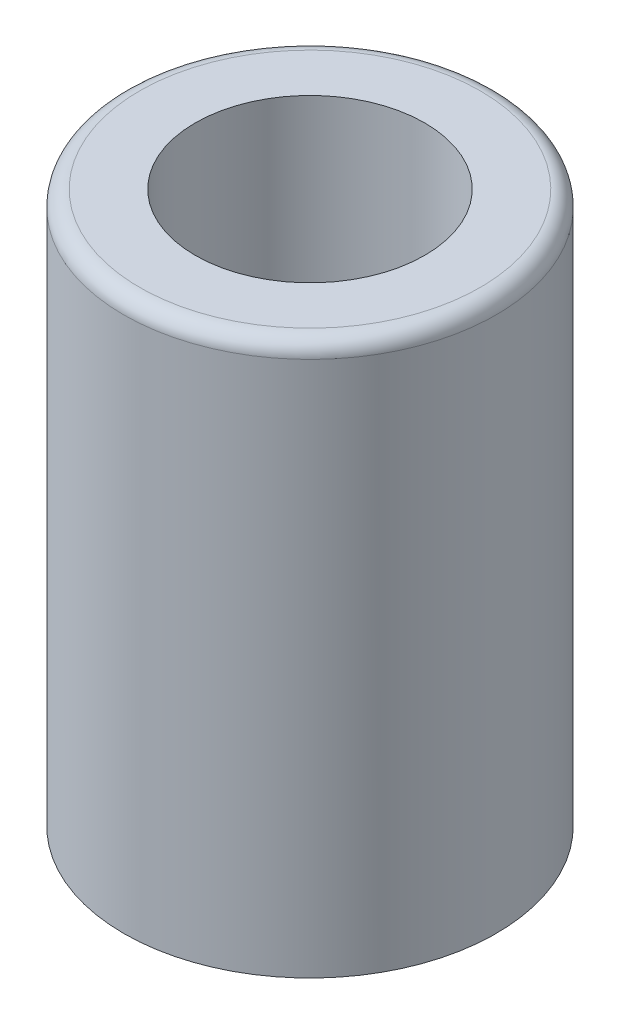
ISO-10303-21;
HEADER;
FILE_DESCRIPTION(('STEP AP214'),'2;1');
FILE_NAME('part.step','',(''),(''),'','','');
FILE_SCHEMA(('AUTOMOTIVE_DESIGN { 1 0 10303 214 1 1 1 1 }'));
ENDSEC;
DATA;
#1=APPLICATION_CONTEXT('core data for automotive mechanical design processes');
#2=APPLICATION_PROTOCOL_DEFINITION('international standard','automotive_design',2000,#1);
#3=PRODUCT_CONTEXT('',#1,'mechanical');
#4=PRODUCT('Part','Part','',(#3));
#5=PRODUCT_RELATED_PRODUCT_CATEGORY('part','',(#4));
#6=PRODUCT_DEFINITION_FORMATION('','',#4);
#7=PRODUCT_DEFINITION_CONTEXT('part definition',#1,'design');
#8=PRODUCT_DEFINITION('design','',#6,#7);
#9=PRODUCT_DEFINITION_SHAPE('','',#8);
#10=(LENGTH_UNIT() NAMED_UNIT(*) SI_UNIT(.MILLI.,.METRE.));
#11=(NAMED_UNIT(*) PLANE_ANGLE_UNIT() SI_UNIT($,.RADIAN.));
#12=(NAMED_UNIT(*) SI_UNIT($,.STERADIAN.) SOLID_ANGLE_UNIT());
#13=UNCERTAINTY_MEASURE_WITH_UNIT(LENGTH_MEASURE(1.E-05),#10,'distance_accuracy_value','');
#14=(GEOMETRIC_REPRESENTATION_CONTEXT(3) GLOBAL_UNCERTAINTY_ASSIGNED_CONTEXT((#13)) GLOBAL_UNIT_ASSIGNED_CONTEXT((#10,
#11,#12)) REPRESENTATION_CONTEXT('',''));
#15=CARTESIAN_POINT('',(0.,0.,0.));
#16=DIRECTION('',(0.,0.,1.));
#17=DIRECTION('',(1.,0.,0.));
#18=AXIS2_PLACEMENT_3D('',#15,#16,#17);
#19=CARTESIAN_POINT('',(0.,0.,0.));
#20=DIRECTION('',(0.,1.,0.));
#21=DIRECTION('',(0.,0.,1.));
#22=AXIS2_PLACEMENT_3D('',#19,#20,#21);
#23=PLANE('',#22);
#24=CARTESIAN_POINT('',(0.,0.,0.));
#25=DIRECTION('',(0.,1.,0.));
#26=DIRECTION('',(0.,0.,1.));
#27=AXIS2_PLACEMENT_3D('',#24,#25,#26);
#28=CIRCLE('',#27,3.52);
#29=CARTESIAN_POINT('',(0.,0.,3.52));
#30=VERTEX_POINT('',#29);
#31=EDGE_CURVE('E42',#30,#30,#28,.T.);
#32=ORIENTED_EDGE('',*,*,#31,.F.);
#33=EDGE_LOOP('',(#32));
#34=FACE_BOUND('',#33,.T.);
#35=ADVANCED_FACE('F31',(#34),#23,.F.);
#36=CARTESIAN_POINT('',(0.,3.80559051091213,0.));
#37=DIRECTION('',(0.,1.,0.));
#38=DIRECTION('',(0.,0.,1.));
#39=AXIS2_PLACEMENT_3D('',#36,#37,#38);
#40=CYLINDRICAL_SURFACE('',#39,3.52);
#41=CARTESIAN_POINT('',(0.,10.13,0.));
#42=DIRECTION('',(0.,-1.,0.));
#43=DIRECTION('',(0.,0.,-1.));
#44=AXIS2_PLACEMENT_3D('',#41,#42,#43);
#45=CIRCLE('',#44,3.52);
#46=CARTESIAN_POINT('',(0.,10.13,-3.52));
#47=VERTEX_POINT('',#46);
#48=EDGE_CURVE('E10',#47,#47,#45,.T.);
#49=ORIENTED_EDGE('',*,*,#48,.T.);
#50=EDGE_LOOP('',(#49));
#51=FACE_BOUND('',#50,.T.);
#52=ORIENTED_EDGE('',*,*,#31,.T.);
#53=EDGE_LOOP('',(#52));
#54=FACE_BOUND('',#53,.T.);
#55=ADVANCED_FACE('F65',(#51,#54),#40,.T.);
#56=CARTESIAN_POINT('',(3.52,10.43,0.));
#57=DIRECTION('',(0.,-1.,0.));
#58=DIRECTION('',(0.,0.,-1.));
#59=AXIS2_PLACEMENT_3D('',#56,#57,#58);
#60=PLANE('',#59);
#61=CARTESIAN_POINT('',(0.,10.43,0.));
#62=DIRECTION('',(0.,-1.,0.));
#63=DIRECTION('',(0.,0.,-1.));
#64=AXIS2_PLACEMENT_3D('',#61,#62,#63);
#65=CIRCLE('',#64,3.22);
#66=CARTESIAN_POINT('',(0.,10.43,-3.22));
#67=VERTEX_POINT('',#66);
#68=EDGE_CURVE('E38',#67,#67,#65,.F.);
#69=ORIENTED_EDGE('',*,*,#68,.T.);
#70=EDGE_LOOP('',(#69));
#71=FACE_BOUND('',#70,.T.);
#72=CARTESIAN_POINT('',(0.,10.43,0.));
#73=DIRECTION('',(0.,1.,0.));
#74=DIRECTION('',(0.,0.,1.));
#75=AXIS2_PLACEMENT_3D('',#72,#73,#74);
#76=CIRCLE('',#75,2.17);
#77=CARTESIAN_POINT('',(0.,10.43,2.17));
#78=VERTEX_POINT('',#77);
#79=EDGE_CURVE('E46',#78,#78,#76,.T.);
#80=ORIENTED_EDGE('',*,*,#79,.F.);
#81=EDGE_LOOP('',(#80));
#82=FACE_BOUND('',#81,.T.);
#83=ADVANCED_FACE('F60',(#71,#82),#60,.F.);
#84=CARTESIAN_POINT('',(0.,3.80559051091213,0.));
#85=DIRECTION('',(0.,1.,0.));
#86=DIRECTION('',(0.,0.,1.));
#87=AXIS2_PLACEMENT_3D('',#84,#85,#86);
#88=CYLINDRICAL_SURFACE('',#87,2.17);
#89=CARTESIAN_POINT('',(0.,3.80559051091213,0.));
#90=DIRECTION('',(0.,1.,0.));
#91=DIRECTION('',(0.,0.,1.));
#92=AXIS2_PLACEMENT_3D('',#89,#90,#91);
#93=CIRCLE('',#92,2.17);
#94=CARTESIAN_POINT('',(0.,3.80559051091213,2.17));
#95=VERTEX_POINT('',#94);
#96=EDGE_CURVE('E51',#95,#95,#93,.T.);
#97=ORIENTED_EDGE('',*,*,#96,.F.);
#98=EDGE_LOOP('',(#97));
#99=FACE_BOUND('',#98,.T.);
#100=ORIENTED_EDGE('',*,*,#79,.T.);
#101=EDGE_LOOP('',(#100));
#102=FACE_BOUND('',#101,.T.);
#103=ADVANCED_FACE('F57',(#99,#102),#88,.F.);
#104=CARTESIAN_POINT('',(2.17,3.80559051091213,0.));
#105=DIRECTION('',(0.,-1.,0.));
#106=DIRECTION('',(0.,0.,-1.));
#107=AXIS2_PLACEMENT_3D('',#104,#105,#106);
#108=PLANE('',#107);
#109=ORIENTED_EDGE('',*,*,#96,.T.);
#110=EDGE_LOOP('',(#109));
#111=FACE_BOUND('',#110,.T.);
#112=ADVANCED_FACE('F55',(#111),#108,.F.);
#113=CARTESIAN_POINT('',(0.,10.13,0.));
#114=DIRECTION('',(0.,-1.,0.));
#115=DIRECTION('',(0.,0.,-1.));
#116=AXIS2_PLACEMENT_3D('',#113,#114,#115);
#117=TOROIDAL_SURFACE('',#116,3.22,0.3);
#118=ORIENTED_EDGE('',*,*,#48,.F.);
#119=EDGE_LOOP('',(#118));
#120=FACE_BOUND('',#119,.T.);
#121=ORIENTED_EDGE('',*,*,#68,.F.);
#122=EDGE_LOOP('',(#121));
#123=FACE_BOUND('',#122,.T.);
#124=ADVANCED_FACE('F33',(#120,#123),#117,.T.);
#125=CLOSED_SHELL('',(#35,#55,#83,#103,#112,#124));
#126=MANIFOLD_SOLID_BREP('B2',#125);
#127=ADVANCED_BREP_SHAPE_REPRESENTATION('',(#18,#126),#14);
#128=SHAPE_DEFINITION_REPRESENTATION(#9,#127);
ENDSEC;
END-ISO-10303-21;
